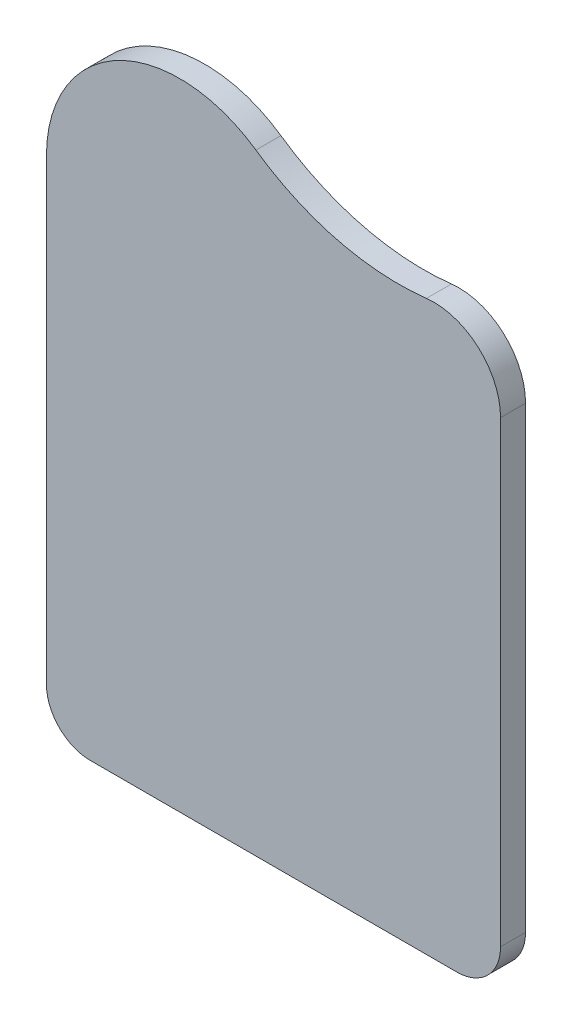
ISO-10303-21;
HEADER;
FILE_DESCRIPTION(('STEP AP214'),'2;1');
FILE_NAME('part.step','',(''),(''),'','','');
FILE_SCHEMA(('AUTOMOTIVE_DESIGN { 1 0 10303 214 1 1 1 1 }'));
ENDSEC;
DATA;
#1=APPLICATION_CONTEXT('core data for automotive mechanical design processes');
#2=APPLICATION_PROTOCOL_DEFINITION('international standard','automotive_design',2000,#1);
#3=PRODUCT_CONTEXT('',#1,'mechanical');
#4=PRODUCT('Part','Part','',(#3));
#5=PRODUCT_RELATED_PRODUCT_CATEGORY('part','',(#4));
#6=PRODUCT_DEFINITION_FORMATION('','',#4);
#7=PRODUCT_DEFINITION_CONTEXT('part definition',#1,'design');
#8=PRODUCT_DEFINITION('design','',#6,#7);
#9=PRODUCT_DEFINITION_SHAPE('','',#8);
#10=(LENGTH_UNIT() NAMED_UNIT(*) SI_UNIT(.MILLI.,.METRE.));
#11=(NAMED_UNIT(*) PLANE_ANGLE_UNIT() SI_UNIT($,.RADIAN.));
#12=(NAMED_UNIT(*) SI_UNIT($,.STERADIAN.) SOLID_ANGLE_UNIT());
#13=UNCERTAINTY_MEASURE_WITH_UNIT(LENGTH_MEASURE(1.E-05),#10,'distance_accuracy_value','');
#14=(GEOMETRIC_REPRESENTATION_CONTEXT(3) GLOBAL_UNCERTAINTY_ASSIGNED_CONTEXT((#13)) GLOBAL_UNIT_ASSIGNED_CONTEXT((#10,
#11,#12)) REPRESENTATION_CONTEXT('',''));
#15=CARTESIAN_POINT('',(0.,0.,0.));
#16=DIRECTION('',(0.,0.,1.));
#17=DIRECTION('',(1.,0.,0.));
#18=AXIS2_PLACEMENT_3D('',#15,#16,#17);
#19=CARTESIAN_POINT('',(21.9999999999999,-22.,20.625));
#20=DIRECTION('',(0.,0.,-1.));
#21=DIRECTION('',(-1.,0.,0.));
#22=AXIS2_PLACEMENT_3D('',#19,#20,#21);
#23=CYLINDRICAL_SURFACE('',#22,5.25000000000012);
#24=CARTESIAN_POINT('',(21.9999999999999,-22.,17.625));
#25=DIRECTION('',(0.,0.,1.));
#26=DIRECTION('',(1.,0.,0.));
#27=AXIS2_PLACEMENT_3D('',#24,#25,#26);
#28=CIRCLE('',#27,5.25000000000012);
#29=CARTESIAN_POINT('',(21.9999999999999,-27.2500000000001,17.625));
#30=VERTEX_POINT('',#29);
#31=CARTESIAN_POINT('',(27.25,-22.,17.625));
#32=VERTEX_POINT('',#31);
#33=EDGE_CURVE('E144',#30,#32,#28,.T.);
#34=ORIENTED_EDGE('',*,*,#33,.T.);
#35=DIRECTION('',(0.,0.,-1.));
#36=VECTOR('',#35,1.);
#37=CARTESIAN_POINT('',(27.25,-22.,20.625));
#38=LINE('',#37,#36);
#39=CARTESIAN_POINT('',(27.25,-22.,20.625));
#40=VERTEX_POINT('',#39);
#41=EDGE_CURVE('E11',#40,#32,#38,.T.);
#42=ORIENTED_EDGE('',*,*,#41,.F.);
#43=CARTESIAN_POINT('',(21.9999999999999,-22.,20.625));
#44=DIRECTION('',(0.,0.,1.));
#45=DIRECTION('',(1.,0.,0.));
#46=AXIS2_PLACEMENT_3D('',#43,#44,#45);
#47=CIRCLE('',#46,5.25000000000012);
#48=CARTESIAN_POINT('',(21.9999999999999,-27.2500000000001,20.625));
#49=VERTEX_POINT('',#48);
#50=EDGE_CURVE('E166',#49,#40,#47,.T.);
#51=ORIENTED_EDGE('',*,*,#50,.F.);
#52=DIRECTION('',(0.,0.,-1.));
#53=VECTOR('',#52,1.);
#54=CARTESIAN_POINT('',(21.9999999999999,-27.2500000000001,20.625));
#55=LINE('',#54,#53);
#56=EDGE_CURVE('E140',#49,#30,#55,.T.);
#57=ORIENTED_EDGE('',*,*,#56,.T.);
#58=EDGE_LOOP('',(#34,#42,#51,#57));
#59=FACE_BOUND('',#58,.T.);
#60=ADVANCED_FACE('F43',(#59),#23,.T.);
#61=CARTESIAN_POINT('',(27.25,-22.,20.625));
#62=DIRECTION('',(-1.,0.,0.));
#63=DIRECTION('',(0.,-1.,0.));
#64=AXIS2_PLACEMENT_3D('',#61,#62,#63);
#65=PLANE('',#64);
#66=DIRECTION('',(0.,1.,0.));
#67=VECTOR('',#66,1.);
#68=CARTESIAN_POINT('',(27.25,-22.,17.625));
#69=LINE('',#68,#67);
#70=CARTESIAN_POINT('',(27.25,33.,17.625));
#71=VERTEX_POINT('',#70);
#72=EDGE_CURVE('E148',#32,#71,#69,.T.);
#73=ORIENTED_EDGE('',*,*,#72,.T.);
#74=DIRECTION('',(0.,0.,-1.));
#75=VECTOR('',#74,1.);
#76=CARTESIAN_POINT('',(27.25,33.,20.625));
#77=LINE('',#76,#75);
#78=CARTESIAN_POINT('',(27.25,33.,20.625));
#79=VERTEX_POINT('',#78);
#80=EDGE_CURVE('E52',#79,#71,#77,.T.);
#81=ORIENTED_EDGE('',*,*,#80,.F.);
#82=DIRECTION('',(0.,1.,0.));
#83=VECTOR('',#82,1.);
#84=CARTESIAN_POINT('',(27.25,-22.,20.625));
#85=LINE('',#84,#83);
#86=EDGE_CURVE('E103',#40,#79,#85,.T.);
#87=ORIENTED_EDGE('',*,*,#86,.F.);
#88=ORIENTED_EDGE('',*,*,#41,.T.);
#89=EDGE_LOOP('',(#73,#81,#87,#88));
#90=FACE_BOUND('',#89,.T.);
#91=ADVANCED_FACE('F212',(#90),#65,.F.);
#92=CARTESIAN_POINT('',(19.25,33.,20.625));
#93=DIRECTION('',(0.,0.,-1.));
#94=DIRECTION('',(-1.,0.,0.));
#95=AXIS2_PLACEMENT_3D('',#92,#93,#94);
#96=CYLINDRICAL_SURFACE('',#95,8.);
#97=CARTESIAN_POINT('',(19.25,33.,17.625));
#98=DIRECTION('',(0.,0.,1.));
#99=DIRECTION('',(1.,0.,0.));
#100=AXIS2_PLACEMENT_3D('',#97,#98,#99);
#101=CIRCLE('',#100,8.);
#102=CARTESIAN_POINT('',(18.3587144089733,40.950195594778,17.625));
#103=VERTEX_POINT('',#102);
#104=EDGE_CURVE('E151',#71,#103,#101,.T.);
#105=ORIENTED_EDGE('',*,*,#104,.T.);
#106=DIRECTION('',(0.,0.,-1.));
#107=VECTOR('',#106,1.);
#108=CARTESIAN_POINT('',(18.3587144089733,40.950195594778,20.625));
#109=LINE('',#108,#107);
#110=CARTESIAN_POINT('',(18.3587144089733,40.950195594778,20.625));
#111=VERTEX_POINT('',#110);
#112=EDGE_CURVE('E177',#111,#103,#109,.T.);
#113=ORIENTED_EDGE('',*,*,#112,.F.);
#114=CARTESIAN_POINT('',(19.25,33.,20.625));
#115=DIRECTION('',(0.,0.,1.));
#116=DIRECTION('',(1.,0.,0.));
#117=AXIS2_PLACEMENT_3D('',#114,#115,#116);
#118=CIRCLE('',#117,8.);
#119=EDGE_CURVE('E187',#79,#111,#118,.T.);
#120=ORIENTED_EDGE('',*,*,#119,.F.);
#121=ORIENTED_EDGE('',*,*,#80,.T.);
#122=EDGE_LOOP('',(#105,#113,#120,#121));
#123=FACE_BOUND('',#122,.T.);
#124=ADVANCED_FACE('F185',(#123),#96,.T.);
#125=CARTESIAN_POINT('',(15.016393442623,70.7634290751957,20.625));
#126=DIRECTION('',(0.,0.,-1.));
#127=DIRECTION('',(-1.,0.,0.));
#128=AXIS2_PLACEMENT_3D('',#125,#126,#127);
#129=CYLINDRICAL_SURFACE('',#128,30.);
#130=CARTESIAN_POINT('',(15.016393442623,70.7634290751957,17.625));
#131=DIRECTION('',(0.,0.,-1.));
#132=DIRECTION('',(1.,0.,0.));
#133=AXIS2_PLACEMENT_3D('',#130,#131,#132);
#134=CIRCLE('',#133,30.);
#135=CARTESIAN_POINT('',(-2.11386315039201,46.1351057652855,17.625));
#136=VERTEX_POINT('',#135);
#137=EDGE_CURVE('E154',#103,#136,#134,.T.);
#138=ORIENTED_EDGE('',*,*,#137,.T.);
#139=DIRECTION('',(0.,0.,-1.));
#140=VECTOR('',#139,1.);
#141=CARTESIAN_POINT('',(-2.11386315039201,46.1351057652855,20.625));
#142=LINE('',#141,#140);
#143=CARTESIAN_POINT('',(-2.11386315039201,46.1351057652855,20.625));
#144=VERTEX_POINT('',#143);
#145=EDGE_CURVE('E173',#144,#136,#142,.T.);
#146=ORIENTED_EDGE('',*,*,#145,.F.);
#147=CARTESIAN_POINT('',(15.016393442623,70.7634290751957,20.625));
#148=DIRECTION('',(0.,0.,-1.));
#149=DIRECTION('',(1.,0.,0.));
#150=AXIS2_PLACEMENT_3D('',#147,#148,#149);
#151=CIRCLE('',#150,30.);
#152=EDGE_CURVE('E200',#111,#144,#151,.T.);
#153=ORIENTED_EDGE('',*,*,#152,.F.);
#154=ORIENTED_EDGE('',*,*,#112,.T.);
#155=EDGE_LOOP('',(#138,#146,#153,#154));
#156=FACE_BOUND('',#155,.T.);
#157=ADVANCED_FACE('F195',(#156),#129,.F.);
#158=CARTESIAN_POINT('',(-11.25,33.,20.625));
#159=DIRECTION('',(0.,0.,-1.));
#160=DIRECTION('',(-1.,0.,0.));
#161=AXIS2_PLACEMENT_3D('',#158,#159,#160);
#162=CYLINDRICAL_SURFACE('',#161,16.);
#163=CARTESIAN_POINT('',(-11.25,33.,17.625));
#164=DIRECTION('',(0.,0.,1.));
#165=DIRECTION('',(1.,0.,0.));
#166=AXIS2_PLACEMENT_3D('',#163,#164,#165);
#167=CIRCLE('',#166,16.);
#168=CARTESIAN_POINT('',(-27.25,33.,17.625));
#169=VERTEX_POINT('',#168);
#170=EDGE_CURVE('E157',#136,#169,#167,.T.);
#171=ORIENTED_EDGE('',*,*,#170,.T.);
#172=DIRECTION('',(0.,0.,-1.));
#173=VECTOR('',#172,1.);
#174=CARTESIAN_POINT('',(-27.25,33.,20.625));
#175=LINE('',#174,#173);
#176=CARTESIAN_POINT('',(-27.25,33.,20.625));
#177=VERTEX_POINT('',#176);
#178=EDGE_CURVE('E133',#177,#169,#175,.T.);
#179=ORIENTED_EDGE('',*,*,#178,.F.);
#180=CARTESIAN_POINT('',(-11.25,33.,20.625));
#181=DIRECTION('',(0.,0.,1.));
#182=DIRECTION('',(1.,0.,0.));
#183=AXIS2_PLACEMENT_3D('',#180,#181,#182);
#184=CIRCLE('',#183,16.);
#185=EDGE_CURVE('E122',#144,#177,#184,.T.);
#186=ORIENTED_EDGE('',*,*,#185,.F.);
#187=ORIENTED_EDGE('',*,*,#145,.T.);
#188=EDGE_LOOP('',(#171,#179,#186,#187));
#189=FACE_BOUND('',#188,.T.);
#190=ADVANCED_FACE('F198',(#189),#162,.T.);
#191=CARTESIAN_POINT('',(-27.25,-21.9999999999999,20.625));
#192=DIRECTION('',(1.,0.,0.));
#193=DIRECTION('',(0.,0.,-1.));
#194=AXIS2_PLACEMENT_3D('',#191,#192,#193);
#195=PLANE('',#194);
#196=DIRECTION('',(0.,-1.,0.));
#197=VECTOR('',#196,1.);
#198=CARTESIAN_POINT('',(-27.25,-21.9999999999999,17.625));
#199=LINE('',#198,#197);
#200=CARTESIAN_POINT('',(-27.25,-21.9999999999999,17.625));
#201=VERTEX_POINT('',#200);
#202=EDGE_CURVE('E131',#169,#201,#199,.T.);
#203=ORIENTED_EDGE('',*,*,#202,.T.);
#204=DIRECTION('',(0.,0.,-1.));
#205=VECTOR('',#204,1.);
#206=CARTESIAN_POINT('',(-27.25,-21.9999999999999,20.625));
#207=LINE('',#206,#205);
#208=CARTESIAN_POINT('',(-27.25,-21.9999999999999,20.625));
#209=VERTEX_POINT('',#208);
#210=EDGE_CURVE('E128',#209,#201,#207,.T.);
#211=ORIENTED_EDGE('',*,*,#210,.F.);
#212=DIRECTION('',(0.,-1.,0.));
#213=VECTOR('',#212,1.);
#214=CARTESIAN_POINT('',(-27.25,-21.9999999999999,20.625));
#215=LINE('',#214,#213);
#216=EDGE_CURVE('E116',#177,#209,#215,.T.);
#217=ORIENTED_EDGE('',*,*,#216,.F.);
#218=ORIENTED_EDGE('',*,*,#178,.T.);
#219=EDGE_LOOP('',(#203,#211,#217,#218));
#220=FACE_BOUND('',#219,.T.);
#221=ADVANCED_FACE('F129',(#220),#195,.F.);
#222=CARTESIAN_POINT('',(-21.9999999999998,-21.9999999999999,20.625));
#223=DIRECTION('',(0.,0.,-1.));
#224=DIRECTION('',(-1.,0.,0.));
#225=AXIS2_PLACEMENT_3D('',#222,#223,#224);
#226=CYLINDRICAL_SURFACE('',#225,5.25000000000019);
#227=CARTESIAN_POINT('',(-21.9999999999998,-21.9999999999999,17.625));
#228=DIRECTION('',(0.,0.,1.));
#229=DIRECTION('',(1.,0.,0.));
#230=AXIS2_PLACEMENT_3D('',#227,#228,#229);
#231=CIRCLE('',#230,5.25000000000019);
#232=CARTESIAN_POINT('',(-21.9999999999998,-27.2500000000001,17.625));
#233=VERTEX_POINT('',#232);
#234=EDGE_CURVE('E89',#201,#233,#231,.T.);
#235=ORIENTED_EDGE('',*,*,#234,.T.);
#236=DIRECTION('',(0.,0.,-1.));
#237=VECTOR('',#236,1.);
#238=CARTESIAN_POINT('',(-21.9999999999998,-27.2500000000001,20.625));
#239=LINE('',#238,#237);
#240=CARTESIAN_POINT('',(-21.9999999999998,-27.2500000000001,20.625));
#241=VERTEX_POINT('',#240);
#242=EDGE_CURVE('E134',#241,#233,#239,.T.);
#243=ORIENTED_EDGE('',*,*,#242,.F.);
#244=CARTESIAN_POINT('',(-21.9999999999998,-21.9999999999999,20.625));
#245=DIRECTION('',(0.,0.,1.));
#246=DIRECTION('',(1.,0.,0.));
#247=AXIS2_PLACEMENT_3D('',#244,#245,#246);
#248=CIRCLE('',#247,5.25000000000019);
#249=EDGE_CURVE('E120',#209,#241,#248,.T.);
#250=ORIENTED_EDGE('',*,*,#249,.F.);
#251=ORIENTED_EDGE('',*,*,#210,.T.);
#252=EDGE_LOOP('',(#235,#243,#250,#251));
#253=FACE_BOUND('',#252,.T.);
#254=ADVANCED_FACE('F136',(#253),#226,.T.);
#255=CARTESIAN_POINT('',(-21.9999999999998,-27.2500000000001,20.625));
#256=DIRECTION('',(0.,1.,0.));
#257=DIRECTION('',(0.,0.,1.));
#258=AXIS2_PLACEMENT_3D('',#255,#256,#257);
#259=PLANE('',#258);
#260=DIRECTION('',(1.,0.,0.));
#261=VECTOR('',#260,1.);
#262=CARTESIAN_POINT('',(-21.9999999999998,-27.2500000000001,17.625));
#263=LINE('',#262,#261);
#264=EDGE_CURVE('E95',#233,#30,#263,.T.);
#265=ORIENTED_EDGE('',*,*,#264,.T.);
#266=ORIENTED_EDGE('',*,*,#56,.F.);
#267=DIRECTION('',(1.,0.,0.));
#268=VECTOR('',#267,1.);
#269=CARTESIAN_POINT('',(-21.9999999999998,-27.2500000000001,20.625));
#270=LINE('',#269,#268);
#271=EDGE_CURVE('E60',#241,#49,#270,.T.);
#272=ORIENTED_EDGE('',*,*,#271,.F.);
#273=ORIENTED_EDGE('',*,*,#242,.T.);
#274=EDGE_LOOP('',(#265,#266,#272,#273));
#275=FACE_BOUND('',#274,.T.);
#276=ADVANCED_FACE('F228',(#275),#259,.F.);
#277=CARTESIAN_POINT('',(21.9999999999999,-22.,20.625));
#278=DIRECTION('',(0.,0.,1.));
#279=DIRECTION('',(1.,0.,0.));
#280=AXIS2_PLACEMENT_3D('',#277,#278,#279);
#281=PLANE('',#280);
#282=ORIENTED_EDGE('',*,*,#50,.T.);
#283=ORIENTED_EDGE('',*,*,#86,.T.);
#284=ORIENTED_EDGE('',*,*,#119,.T.);
#285=ORIENTED_EDGE('',*,*,#152,.T.);
#286=ORIENTED_EDGE('',*,*,#185,.T.);
#287=ORIENTED_EDGE('',*,*,#216,.T.);
#288=ORIENTED_EDGE('',*,*,#249,.T.);
#289=ORIENTED_EDGE('',*,*,#271,.T.);
#290=EDGE_LOOP('',(#282,#283,#284,#285,#286,#287,#288,#289));
#291=FACE_BOUND('',#290,.T.);
#292=ADVANCED_FACE('F118',(#291),#281,.T.);
#293=CARTESIAN_POINT('',(21.9999999999999,-22.,17.625));
#294=DIRECTION('',(0.,0.,1.));
#295=DIRECTION('',(1.,0.,0.));
#296=AXIS2_PLACEMENT_3D('',#293,#294,#295);
#297=PLANE('',#296);
#298=ORIENTED_EDGE('',*,*,#33,.F.);
#299=ORIENTED_EDGE('',*,*,#264,.F.);
#300=ORIENTED_EDGE('',*,*,#234,.F.);
#301=ORIENTED_EDGE('',*,*,#202,.F.);
#302=ORIENTED_EDGE('',*,*,#170,.F.);
#303=ORIENTED_EDGE('',*,*,#137,.F.);
#304=ORIENTED_EDGE('',*,*,#104,.F.);
#305=ORIENTED_EDGE('',*,*,#72,.F.);
#306=EDGE_LOOP('',(#298,#299,#300,#301,#302,#303,#304,#305));
#307=FACE_BOUND('',#306,.T.);
#308=ADVANCED_FACE('F191',(#307),#297,.F.);
#309=CLOSED_SHELL('',(#60,#91,#124,#157,#190,#221,#254,#276,#292,#308));
#310=MANIFOLD_SOLID_BREP('B2',#309);
#311=ADVANCED_BREP_SHAPE_REPRESENTATION('',(#18,#310),#14);
#312=SHAPE_DEFINITION_REPRESENTATION(#9,#311);
ENDSEC;
END-ISO-10303-21;
